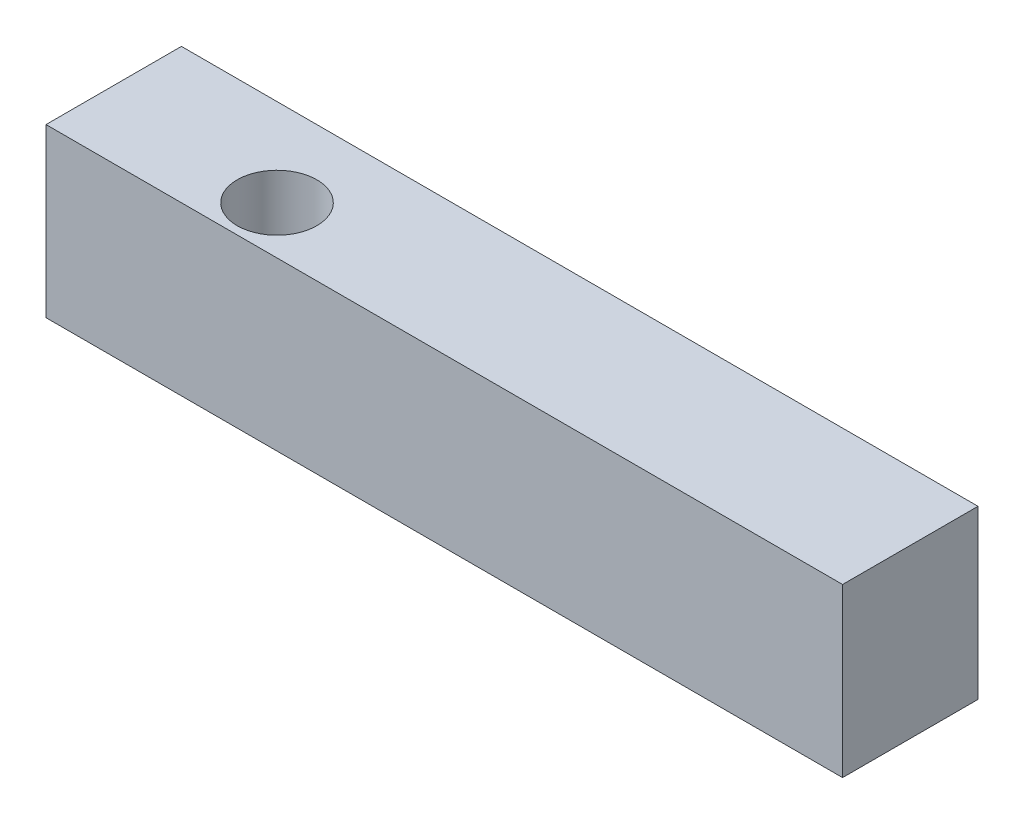
ISO-10303-21;
HEADER;
FILE_DESCRIPTION(('STEP AP214'),'2;1');
FILE_NAME('part.step','',(''),(''),'','','');
FILE_SCHEMA(('AUTOMOTIVE_DESIGN { 1 0 10303 214 1 1 1 1 }'));
ENDSEC;
DATA;
#1=APPLICATION_CONTEXT('core data for automotive mechanical design processes');
#2=APPLICATION_PROTOCOL_DEFINITION('international standard','automotive_design',2000,#1);
#3=PRODUCT_CONTEXT('',#1,'mechanical');
#4=PRODUCT('Part','Part','',(#3));
#5=PRODUCT_RELATED_PRODUCT_CATEGORY('part','',(#4));
#6=PRODUCT_DEFINITION_FORMATION('','',#4);
#7=PRODUCT_DEFINITION_CONTEXT('part definition',#1,'design');
#8=PRODUCT_DEFINITION('design','',#6,#7);
#9=PRODUCT_DEFINITION_SHAPE('','',#8);
#10=(LENGTH_UNIT() NAMED_UNIT(*) SI_UNIT(.MILLI.,.METRE.));
#11=(NAMED_UNIT(*) PLANE_ANGLE_UNIT() SI_UNIT($,.RADIAN.));
#12=(NAMED_UNIT(*) SI_UNIT($,.STERADIAN.) SOLID_ANGLE_UNIT());
#13=UNCERTAINTY_MEASURE_WITH_UNIT(LENGTH_MEASURE(1.E-05),#10,'distance_accuracy_value','');
#14=(GEOMETRIC_REPRESENTATION_CONTEXT(3) GLOBAL_UNCERTAINTY_ASSIGNED_CONTEXT((#13)) GLOBAL_UNIT_ASSIGNED_CONTEXT((#10,
#11,#12)) REPRESENTATION_CONTEXT('',''));
#15=CARTESIAN_POINT('',(0.,0.,0.));
#16=DIRECTION('',(0.,0.,1.));
#17=DIRECTION('',(1.,0.,0.));
#18=AXIS2_PLACEMENT_3D('',#15,#16,#17);
#19=CARTESIAN_POINT('',(-4.79472522200492,2.38246535579975,4.318));
#20=DIRECTION('',(1.,0.,0.));
#21=DIRECTION('',(0.,1.,0.));
#22=AXIS2_PLACEMENT_3D('',#19,#20,#21);
#23=PLANE('',#22);
#24=DIRECTION('',(0.,-1.,0.));
#25=VECTOR('',#24,1.);
#26=CARTESIAN_POINT('',(-4.79472522200492,2.38246535579975,0.));
#27=LINE('',#26,#25);
#28=CARTESIAN_POINT('',(-4.79472522200492,2.38246535579975,0.));
#29=VERTEX_POINT('',#28);
#30=CARTESIAN_POINT('',(-4.79472522200492,-2.95153464420025,0.));
#31=VERTEX_POINT('',#30);
#32=EDGE_CURVE('E100',#29,#31,#27,.T.);
#33=ORIENTED_EDGE('',*,*,#32,.T.);
#34=DIRECTION('',(0.,0.,-1.));
#35=VECTOR('',#34,1.);
#36=CARTESIAN_POINT('',(-4.79472522200492,-2.95153464420025,4.318));
#37=LINE('',#36,#35);
#38=CARTESIAN_POINT('',(-4.79472522200492,-2.95153464420025,4.318));
#39=VERTEX_POINT('',#38);
#40=EDGE_CURVE('E11',#39,#31,#37,.T.);
#41=ORIENTED_EDGE('',*,*,#40,.F.);
#42=DIRECTION('',(0.,-1.,0.));
#43=VECTOR('',#42,1.);
#44=CARTESIAN_POINT('',(-4.79472522200492,2.38246535579975,4.318));
#45=LINE('',#44,#43);
#46=CARTESIAN_POINT('',(-4.79472522200492,2.38246535579975,4.318));
#47=VERTEX_POINT('',#46);
#48=EDGE_CURVE('E88',#47,#39,#45,.T.);
#49=ORIENTED_EDGE('',*,*,#48,.F.);
#50=DIRECTION('',(0.,0.,-1.));
#51=VECTOR('',#50,1.);
#52=CARTESIAN_POINT('',(-4.79472522200492,2.38246535579975,4.318));
#53=LINE('',#52,#51);
#54=EDGE_CURVE('E96',#47,#29,#53,.T.);
#55=ORIENTED_EDGE('',*,*,#54,.T.);
#56=EDGE_LOOP('',(#33,#41,#49,#55));
#57=FACE_BOUND('',#56,.T.);
#58=ADVANCED_FACE('F37',(#57),#23,.F.);
#59=CARTESIAN_POINT('',(-4.79472522200492,-2.95153464420025,4.318));
#60=DIRECTION('',(0.,1.,0.));
#61=DIRECTION('',(0.,0.,1.));
#62=AXIS2_PLACEMENT_3D('',#59,#60,#61);
#63=PLANE('',#62);
#64=CARTESIAN_POINT('',(1.04727477799508,-2.95153464420025,2.794));
#65=DIRECTION('',(0.,1.,0.));
#66=DIRECTION('',(0.,0.,1.));
#67=AXIS2_PLACEMENT_3D('',#64,#65,#66);
#68=CIRCLE('',#67,1.27000000000003);
#69=CARTESIAN_POINT('',(1.04727477799508,-2.95153464420025,4.06400000000003));
#70=VERTEX_POINT('',#69);
#71=EDGE_CURVE('E103',#70,#70,#68,.T.);
#72=ORIENTED_EDGE('',*,*,#71,.T.);
#73=EDGE_LOOP('',(#72));
#74=FACE_BOUND('',#73,.T.);
#75=DIRECTION('',(1.,0.,0.));
#76=VECTOR('',#75,1.);
#77=CARTESIAN_POINT('',(-4.79472522200492,-2.95153464420025,0.));
#78=LINE('',#77,#76);
#79=CARTESIAN_POINT('',(20.6052747779951,-2.95153464420025,0.));
#80=VERTEX_POINT('',#79);
#81=EDGE_CURVE('E92',#31,#80,#78,.T.);
#82=ORIENTED_EDGE('',*,*,#81,.T.);
#83=DIRECTION('',(0.,0.,-1.));
#84=VECTOR('',#83,1.);
#85=CARTESIAN_POINT('',(20.6052747779951,-2.95153464420025,4.318));
#86=LINE('',#85,#84);
#87=CARTESIAN_POINT('',(20.6052747779951,-2.95153464420025,4.318));
#88=VERTEX_POINT('',#87);
#89=EDGE_CURVE('E45',#88,#80,#86,.T.);
#90=ORIENTED_EDGE('',*,*,#89,.F.);
#91=DIRECTION('',(1.,0.,0.));
#92=VECTOR('',#91,1.);
#93=CARTESIAN_POINT('',(-4.79472522200492,-2.95153464420025,4.318));
#94=LINE('',#93,#92);
#95=EDGE_CURVE('E83',#39,#88,#94,.T.);
#96=ORIENTED_EDGE('',*,*,#95,.F.);
#97=ORIENTED_EDGE('',*,*,#40,.T.);
#98=EDGE_LOOP('',(#82,#90,#96,#97));
#99=FACE_BOUND('',#98,.T.);
#100=ADVANCED_FACE('F91',(#74,#99),#63,.F.);
#101=CARTESIAN_POINT('',(20.6052747779951,2.38246535579975,4.318));
#102=DIRECTION('',(-1.,0.,0.));
#103=DIRECTION('',(0.,0.,1.));
#104=AXIS2_PLACEMENT_3D('',#101,#102,#103);
#105=PLANE('',#104);
#106=DIRECTION('',(0.,1.,0.));
#107=VECTOR('',#106,1.);
#108=CARTESIAN_POINT('',(20.6052747779951,2.38246535579975,0.));
#109=LINE('',#108,#107);
#110=CARTESIAN_POINT('',(20.6052747779951,2.38246535579975,0.));
#111=VERTEX_POINT('',#110);
#112=EDGE_CURVE('E70',#80,#111,#109,.T.);
#113=ORIENTED_EDGE('',*,*,#112,.T.);
#114=DIRECTION('',(0.,0.,-1.));
#115=VECTOR('',#114,1.);
#116=CARTESIAN_POINT('',(20.6052747779951,2.38246535579975,4.318));
#117=LINE('',#116,#115);
#118=CARTESIAN_POINT('',(20.6052747779951,2.38246535579975,4.318));
#119=VERTEX_POINT('',#118);
#120=EDGE_CURVE('E93',#119,#111,#117,.T.);
#121=ORIENTED_EDGE('',*,*,#120,.F.);
#122=DIRECTION('',(0.,1.,0.));
#123=VECTOR('',#122,1.);
#124=CARTESIAN_POINT('',(20.6052747779951,2.38246535579975,4.318));
#125=LINE('',#124,#123);
#126=EDGE_CURVE('E86',#88,#119,#125,.T.);
#127=ORIENTED_EDGE('',*,*,#126,.F.);
#128=ORIENTED_EDGE('',*,*,#89,.T.);
#129=EDGE_LOOP('',(#113,#121,#127,#128));
#130=FACE_BOUND('',#129,.T.);
#131=ADVANCED_FACE('F94',(#130),#105,.F.);
#132=CARTESIAN_POINT('',(-4.79472522200492,2.38246535579975,4.318));
#133=DIRECTION('',(0.,-1.,0.));
#134=DIRECTION('',(0.,0.,-1.));
#135=AXIS2_PLACEMENT_3D('',#132,#133,#134);
#136=PLANE('',#135);
#137=CARTESIAN_POINT('',(1.04727477799508,2.38246535579975,2.794));
#138=DIRECTION('',(0.,1.,0.));
#139=DIRECTION('',(0.,0.,1.));
#140=AXIS2_PLACEMENT_3D('',#137,#138,#139);
#141=CIRCLE('',#140,1.27000000000003);
#142=CARTESIAN_POINT('',(1.04727477799508,2.38246535579975,4.06400000000003));
#143=VERTEX_POINT('',#142);
#144=EDGE_CURVE('E114',#143,#143,#141,.T.);
#145=ORIENTED_EDGE('',*,*,#144,.F.);
#146=EDGE_LOOP('',(#145));
#147=FACE_BOUND('',#146,.T.);
#148=DIRECTION('',(-1.,0.,0.));
#149=VECTOR('',#148,1.);
#150=CARTESIAN_POINT('',(-4.79472522200492,2.38246535579975,0.));
#151=LINE('',#150,#149);
#152=EDGE_CURVE('E76',#111,#29,#151,.T.);
#153=ORIENTED_EDGE('',*,*,#152,.T.);
#154=ORIENTED_EDGE('',*,*,#54,.F.);
#155=DIRECTION('',(-1.,0.,0.));
#156=VECTOR('',#155,1.);
#157=CARTESIAN_POINT('',(-4.79472522200492,2.38246535579975,4.318));
#158=LINE('',#157,#156);
#159=EDGE_CURVE('E53',#119,#47,#158,.T.);
#160=ORIENTED_EDGE('',*,*,#159,.F.);
#161=ORIENTED_EDGE('',*,*,#120,.T.);
#162=EDGE_LOOP('',(#153,#154,#160,#161));
#163=FACE_BOUND('',#162,.T.);
#164=ADVANCED_FACE('F108',(#147,#163),#136,.F.);
#165=CARTESIAN_POINT('',(0.,0.,4.318));
#166=DIRECTION('',(0.,0.,1.));
#167=DIRECTION('',(1.,0.,0.));
#168=AXIS2_PLACEMENT_3D('',#165,#166,#167);
#169=PLANE('',#168);
#170=ORIENTED_EDGE('',*,*,#48,.T.);
#171=ORIENTED_EDGE('',*,*,#95,.T.);
#172=ORIENTED_EDGE('',*,*,#126,.T.);
#173=ORIENTED_EDGE('',*,*,#159,.T.);
#174=EDGE_LOOP('',(#170,#171,#172,#173));
#175=FACE_BOUND('',#174,.T.);
#176=ADVANCED_FACE('F84',(#175),#169,.T.);
#177=CARTESIAN_POINT('',(0.,0.,0.));
#178=DIRECTION('',(0.,0.,1.));
#179=DIRECTION('',(1.,0.,0.));
#180=AXIS2_PLACEMENT_3D('',#177,#178,#179);
#181=PLANE('',#180);
#182=ORIENTED_EDGE('',*,*,#32,.F.);
#183=ORIENTED_EDGE('',*,*,#152,.F.);
#184=ORIENTED_EDGE('',*,*,#112,.F.);
#185=ORIENTED_EDGE('',*,*,#81,.F.);
#186=EDGE_LOOP('',(#182,#183,#184,#185));
#187=FACE_BOUND('',#186,.T.);
#188=ADVANCED_FACE('F111',(#187),#181,.F.);
#189=CARTESIAN_POINT('',(1.04727477799508,-2.95153464420025,2.794));
#190=DIRECTION('',(0.,1.,0.));
#191=DIRECTION('',(0.,0.,1.));
#192=AXIS2_PLACEMENT_3D('',#189,#190,#191);
#193=CYLINDRICAL_SURFACE('',#192,1.27000000000003);
#194=ORIENTED_EDGE('',*,*,#71,.F.);
#195=EDGE_LOOP('',(#194));
#196=FACE_BOUND('',#195,.T.);
#197=ORIENTED_EDGE('',*,*,#144,.T.);
#198=EDGE_LOOP('',(#197));
#199=FACE_BOUND('',#198,.T.);
#200=ADVANCED_FACE('F121',(#196,#199),#193,.F.);
#201=CLOSED_SHELL('',(#58,#100,#131,#164,#176,#188,#200));
#202=MANIFOLD_SOLID_BREP('B2',#201);
#203=ADVANCED_BREP_SHAPE_REPRESENTATION('',(#18,#202),#14);
#204=SHAPE_DEFINITION_REPRESENTATION(#9,#203);
ENDSEC;
END-ISO-10303-21;
